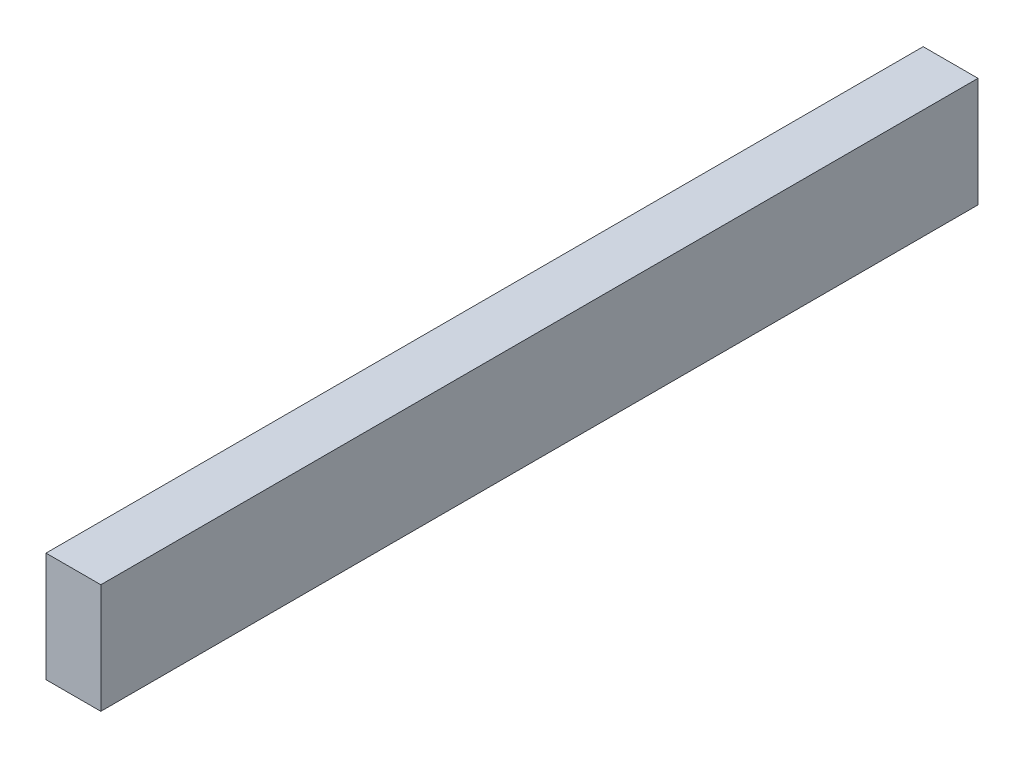
ISO-10303-21;
HEADER;
FILE_DESCRIPTION(('STEP AP214'),'2;1');
FILE_NAME('part.step','',(''),(''),'','','');
FILE_SCHEMA(('AUTOMOTIVE_DESIGN { 1 0 10303 214 1 1 1 1 }'));
ENDSEC;
DATA;
#1=APPLICATION_CONTEXT('core data for automotive mechanical design processes');
#2=APPLICATION_PROTOCOL_DEFINITION('international standard','automotive_design',2000,#1);
#3=PRODUCT_CONTEXT('',#1,'mechanical');
#4=PRODUCT('Part','Part','',(#3));
#5=PRODUCT_RELATED_PRODUCT_CATEGORY('part','',(#4));
#6=PRODUCT_DEFINITION_FORMATION('','',#4);
#7=PRODUCT_DEFINITION_CONTEXT('part definition',#1,'design');
#8=PRODUCT_DEFINITION('design','',#6,#7);
#9=PRODUCT_DEFINITION_SHAPE('','',#8);
#10=(LENGTH_UNIT() NAMED_UNIT(*) SI_UNIT(.MILLI.,.METRE.));
#11=(NAMED_UNIT(*) PLANE_ANGLE_UNIT() SI_UNIT($,.RADIAN.));
#12=(NAMED_UNIT(*) SI_UNIT($,.STERADIAN.) SOLID_ANGLE_UNIT());
#13=UNCERTAINTY_MEASURE_WITH_UNIT(LENGTH_MEASURE(1.E-05),#10,'distance_accuracy_value','');
#14=(GEOMETRIC_REPRESENTATION_CONTEXT(3) GLOBAL_UNCERTAINTY_ASSIGNED_CONTEXT((#13)) GLOBAL_UNIT_ASSIGNED_CONTEXT((#10,
#11,#12)) REPRESENTATION_CONTEXT('',''));
#15=CARTESIAN_POINT('',(0.,0.,0.));
#16=DIRECTION('',(0.,0.,1.));
#17=DIRECTION('',(1.,0.,0.));
#18=AXIS2_PLACEMENT_3D('',#15,#16,#17);
#19=CARTESIAN_POINT('',(25.4,-50.8,812.8));
#20=DIRECTION('',(-1.,0.,0.));
#21=DIRECTION('',(0.,0.,1.));
#22=AXIS2_PLACEMENT_3D('',#19,#20,#21);
#23=PLANE('',#22);
#24=DIRECTION('',(0.,1.,0.));
#25=VECTOR('',#24,1.);
#26=CARTESIAN_POINT('',(25.4,-50.8,0.));
#27=LINE('',#26,#25);
#28=CARTESIAN_POINT('',(25.4,-50.8,0.));
#29=VERTEX_POINT('',#28);
#30=CARTESIAN_POINT('',(25.4,50.8,0.));
#31=VERTEX_POINT('',#30);
#32=EDGE_CURVE('E95',#29,#31,#27,.T.);
#33=ORIENTED_EDGE('',*,*,#32,.T.);
#34=DIRECTION('',(0.,0.,-1.));
#35=VECTOR('',#34,1.);
#36=CARTESIAN_POINT('',(25.4,50.8,812.8));
#37=LINE('',#36,#35);
#38=CARTESIAN_POINT('',(25.4,50.8,812.8));
#39=VERTEX_POINT('',#38);
#40=EDGE_CURVE('E11',#39,#31,#37,.T.);
#41=ORIENTED_EDGE('',*,*,#40,.F.);
#42=DIRECTION('',(0.,1.,0.));
#43=VECTOR('',#42,1.);
#44=CARTESIAN_POINT('',(25.4,-50.8,812.8));
#45=LINE('',#44,#43);
#46=CARTESIAN_POINT('',(25.4,-50.8,812.8));
#47=VERTEX_POINT('',#46);
#48=EDGE_CURVE('E83',#47,#39,#45,.T.);
#49=ORIENTED_EDGE('',*,*,#48,.F.);
#50=DIRECTION('',(0.,0.,-1.));
#51=VECTOR('',#50,1.);
#52=CARTESIAN_POINT('',(25.4,-50.8,812.8));
#53=LINE('',#52,#51);
#54=EDGE_CURVE('E91',#47,#29,#53,.T.);
#55=ORIENTED_EDGE('',*,*,#54,.T.);
#56=EDGE_LOOP('',(#33,#41,#49,#55));
#57=FACE_BOUND('',#56,.T.);
#58=ADVANCED_FACE('F32',(#57),#23,.F.);
#59=CARTESIAN_POINT('',(-25.4,50.8,812.8));
#60=DIRECTION('',(0.,-1.,0.));
#61=DIRECTION('',(0.,0.,-1.));
#62=AXIS2_PLACEMENT_3D('',#59,#60,#61);
#63=PLANE('',#62);
#64=DIRECTION('',(-1.,0.,0.));
#65=VECTOR('',#64,1.);
#66=CARTESIAN_POINT('',(-25.4,50.8,0.));
#67=LINE('',#66,#65);
#68=CARTESIAN_POINT('',(-25.4,50.8,0.));
#69=VERTEX_POINT('',#68);
#70=EDGE_CURVE('E87',#31,#69,#67,.T.);
#71=ORIENTED_EDGE('',*,*,#70,.T.);
#72=DIRECTION('',(0.,0.,-1.));
#73=VECTOR('',#72,1.);
#74=CARTESIAN_POINT('',(-25.4,50.8,812.8));
#75=LINE('',#74,#73);
#76=CARTESIAN_POINT('',(-25.4,50.8,812.8));
#77=VERTEX_POINT('',#76);
#78=EDGE_CURVE('E40',#77,#69,#75,.T.);
#79=ORIENTED_EDGE('',*,*,#78,.F.);
#80=DIRECTION('',(-1.,0.,0.));
#81=VECTOR('',#80,1.);
#82=CARTESIAN_POINT('',(-25.4,50.8,812.8));
#83=LINE('',#82,#81);
#84=EDGE_CURVE('E78',#39,#77,#83,.T.);
#85=ORIENTED_EDGE('',*,*,#84,.F.);
#86=ORIENTED_EDGE('',*,*,#40,.T.);
#87=EDGE_LOOP('',(#71,#79,#85,#86));
#88=FACE_BOUND('',#87,.T.);
#89=ADVANCED_FACE('F86',(#88),#63,.F.);
#90=CARTESIAN_POINT('',(-25.4,-50.8,812.8));
#91=DIRECTION('',(1.,0.,0.));
#92=DIRECTION('',(0.,0.,-1.));
#93=AXIS2_PLACEMENT_3D('',#90,#91,#92);
#94=PLANE('',#93);
#95=DIRECTION('',(0.,-1.,0.));
#96=VECTOR('',#95,1.);
#97=CARTESIAN_POINT('',(-25.4,-50.8,0.));
#98=LINE('',#97,#96);
#99=CARTESIAN_POINT('',(-25.4,-50.8,0.));
#100=VERTEX_POINT('',#99);
#101=EDGE_CURVE('E65',#69,#100,#98,.T.);
#102=ORIENTED_EDGE('',*,*,#101,.T.);
#103=DIRECTION('',(0.,0.,-1.));
#104=VECTOR('',#103,1.);
#105=CARTESIAN_POINT('',(-25.4,-50.8,812.8));
#106=LINE('',#105,#104);
#107=CARTESIAN_POINT('',(-25.4,-50.8,812.8));
#108=VERTEX_POINT('',#107);
#109=EDGE_CURVE('E88',#108,#100,#106,.T.);
#110=ORIENTED_EDGE('',*,*,#109,.F.);
#111=DIRECTION('',(0.,-1.,0.));
#112=VECTOR('',#111,1.);
#113=CARTESIAN_POINT('',(-25.4,-50.8,812.8));
#114=LINE('',#113,#112);
#115=EDGE_CURVE('E81',#77,#108,#114,.T.);
#116=ORIENTED_EDGE('',*,*,#115,.F.);
#117=ORIENTED_EDGE('',*,*,#78,.T.);
#118=EDGE_LOOP('',(#102,#110,#116,#117));
#119=FACE_BOUND('',#118,.T.);
#120=ADVANCED_FACE('F89',(#119),#94,.F.);
#121=CARTESIAN_POINT('',(-25.4,-50.8,812.8));
#122=DIRECTION('',(0.,1.,0.));
#123=DIRECTION('',(0.,0.,1.));
#124=AXIS2_PLACEMENT_3D('',#121,#122,#123);
#125=PLANE('',#124);
#126=DIRECTION('',(1.,0.,0.));
#127=VECTOR('',#126,1.);
#128=CARTESIAN_POINT('',(-25.4,-50.8,0.));
#129=LINE('',#128,#127);
#130=EDGE_CURVE('E71',#100,#29,#129,.T.);
#131=ORIENTED_EDGE('',*,*,#130,.T.);
#132=ORIENTED_EDGE('',*,*,#54,.F.);
#133=DIRECTION('',(1.,0.,0.));
#134=VECTOR('',#133,1.);
#135=CARTESIAN_POINT('',(-25.4,-50.8,812.8));
#136=LINE('',#135,#134);
#137=EDGE_CURVE('E48',#108,#47,#136,.T.);
#138=ORIENTED_EDGE('',*,*,#137,.F.);
#139=ORIENTED_EDGE('',*,*,#109,.T.);
#140=EDGE_LOOP('',(#131,#132,#138,#139));
#141=FACE_BOUND('',#140,.T.);
#142=ADVANCED_FACE('F102',(#141),#125,.F.);
#143=CARTESIAN_POINT('',(0.,0.,812.8));
#144=DIRECTION('',(0.,0.,-1.));
#145=DIRECTION('',(-1.,0.,0.));
#146=AXIS2_PLACEMENT_3D('',#143,#144,#145);
#147=PLANE('',#146);
#148=ORIENTED_EDGE('',*,*,#48,.T.);
#149=ORIENTED_EDGE('',*,*,#84,.T.);
#150=ORIENTED_EDGE('',*,*,#115,.T.);
#151=ORIENTED_EDGE('',*,*,#137,.T.);
#152=EDGE_LOOP('',(#148,#149,#150,#151));
#153=FACE_BOUND('',#152,.T.);
#154=ADVANCED_FACE('F79',(#153),#147,.F.);
#155=CARTESIAN_POINT('',(0.,0.,0.));
#156=DIRECTION('',(0.,0.,-1.));
#157=DIRECTION('',(-1.,0.,0.));
#158=AXIS2_PLACEMENT_3D('',#155,#156,#157);
#159=PLANE('',#158);
#160=ORIENTED_EDGE('',*,*,#32,.F.);
#161=ORIENTED_EDGE('',*,*,#130,.F.);
#162=ORIENTED_EDGE('',*,*,#101,.F.);
#163=ORIENTED_EDGE('',*,*,#70,.F.);
#164=EDGE_LOOP('',(#160,#161,#162,#163));
#165=FACE_BOUND('',#164,.T.);
#166=ADVANCED_FACE('F105',(#165),#159,.T.);
#167=CLOSED_SHELL('',(#58,#89,#120,#142,#154,#166));
#168=MANIFOLD_SOLID_BREP('B2',#167);
#169=ADVANCED_BREP_SHAPE_REPRESENTATION('',(#18,#168),#14);
#170=SHAPE_DEFINITION_REPRESENTATION(#9,#169);
ENDSEC;
END-ISO-10303-21;
